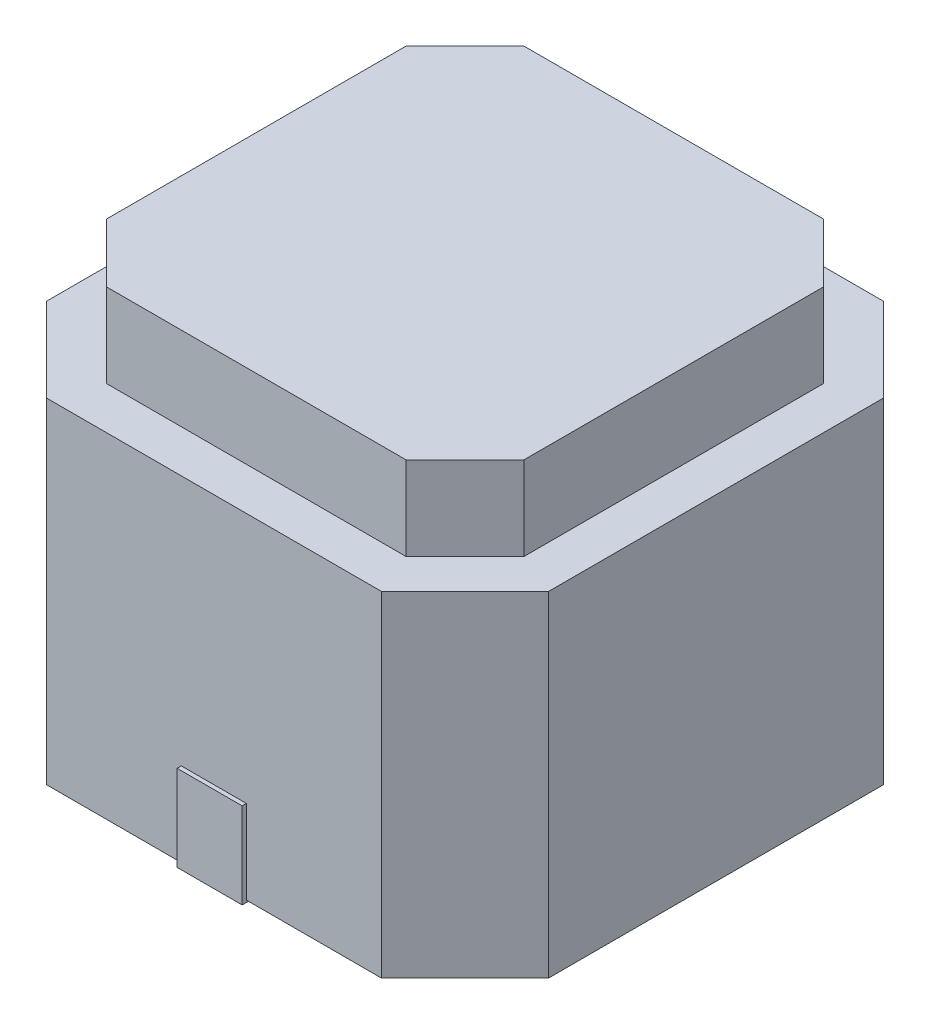
ISO-10303-21;
HEADER;
FILE_DESCRIPTION(('STEP AP214'),'2;1');
FILE_NAME('part.step','',(''),(''),'','','');
FILE_SCHEMA(('AUTOMOTIVE_DESIGN { 1 0 10303 214 1 1 1 1 }'));
ENDSEC;
DATA;
#1=APPLICATION_CONTEXT('core data for automotive mechanical design processes');
#2=APPLICATION_PROTOCOL_DEFINITION('international standard','automotive_design',2000,#1);
#3=PRODUCT_CONTEXT('',#1,'mechanical');
#4=PRODUCT('Part','Part','',(#3));
#5=PRODUCT_RELATED_PRODUCT_CATEGORY('part','',(#4));
#6=PRODUCT_DEFINITION_FORMATION('','',#4);
#7=PRODUCT_DEFINITION_CONTEXT('part definition',#1,'design');
#8=PRODUCT_DEFINITION('design','',#6,#7);
#9=PRODUCT_DEFINITION_SHAPE('','',#8);
#10=(LENGTH_UNIT() NAMED_UNIT(*) SI_UNIT(.MILLI.,.METRE.));
#11=(NAMED_UNIT(*) PLANE_ANGLE_UNIT() SI_UNIT($,.RADIAN.));
#12=(NAMED_UNIT(*) SI_UNIT($,.STERADIAN.) SOLID_ANGLE_UNIT());
#13=UNCERTAINTY_MEASURE_WITH_UNIT(LENGTH_MEASURE(1.E-05),#10,'distance_accuracy_value','');
#14=(GEOMETRIC_REPRESENTATION_CONTEXT(3) GLOBAL_UNCERTAINTY_ASSIGNED_CONTEXT((#13)) GLOBAL_UNIT_ASSIGNED_CONTEXT((#10,
#11,#12)) REPRESENTATION_CONTEXT('',''));
#15=CARTESIAN_POINT('',(0.,0.,0.));
#16=DIRECTION('',(0.,0.,1.));
#17=DIRECTION('',(1.,0.,0.));
#18=AXIS2_PLACEMENT_3D('',#15,#16,#17);
#19=CARTESIAN_POINT('',(2.,5.,-3.));
#20=DIRECTION('',(-0.707106781186548,0.,0.707106781186547));
#21=DIRECTION('',(0.707106781186547,0.,0.707106781186548));
#22=AXIS2_PLACEMENT_3D('',#19,#20,#21);
#23=PLANE('',#22);
#24=DIRECTION('',(-0.707106781186547,0.,-0.707106781186548));
#25=VECTOR('',#24,1.);
#26=CARTESIAN_POINT('',(2.5,4.,-2.5));
#27=LINE('',#26,#25);
#28=CARTESIAN_POINT('',(3.,4.,-2.));
#29=VERTEX_POINT('',#28);
#30=CARTESIAN_POINT('',(2.,4.,-3.));
#31=VERTEX_POINT('',#30);
#32=EDGE_CURVE('E408',#29,#31,#27,.T.);
#33=ORIENTED_EDGE('',*,*,#32,.F.);
#34=DIRECTION('',(0.,-1.,0.));
#35=VECTOR('',#34,1.);
#36=CARTESIAN_POINT('',(3.,5.,-2.));
#37=LINE('',#36,#35);
#38=CARTESIAN_POINT('',(3.,0.,-2.));
#39=VERTEX_POINT('',#38);
#40=EDGE_CURVE('E487',#29,#39,#37,.T.);
#41=ORIENTED_EDGE('',*,*,#40,.T.);
#42=DIRECTION('',(-0.707106781186547,0.,-0.707106781186548));
#43=VECTOR('',#42,1.);
#44=CARTESIAN_POINT('',(2.,0.,-3.));
#45=LINE('',#44,#43);
#46=CARTESIAN_POINT('',(2.,0.,-3.));
#47=VERTEX_POINT('',#46);
#48=EDGE_CURVE('E448',#39,#47,#45,.T.);
#49=ORIENTED_EDGE('',*,*,#48,.T.);
#50=DIRECTION('',(0.,-1.,0.));
#51=VECTOR('',#50,1.);
#52=CARTESIAN_POINT('',(2.,5.,-3.));
#53=LINE('',#52,#51);
#54=EDGE_CURVE('E503',#31,#47,#53,.T.);
#55=ORIENTED_EDGE('',*,*,#54,.F.);
#56=EDGE_LOOP('',(#33,#41,#49,#55));
#57=FACE_BOUND('',#56,.T.);
#58=ADVANCED_FACE('F128',(#57),#23,.F.);
#59=CARTESIAN_POINT('',(-2.,5.,-3.));
#60=DIRECTION('',(0.,0.,1.));
#61=DIRECTION('',(1.,0.,0.));
#62=AXIS2_PLACEMENT_3D('',#59,#60,#61);
#63=PLANE('',#62);
#64=DIRECTION('',(-1.,0.,0.));
#65=VECTOR('',#64,1.);
#66=CARTESIAN_POINT('',(-2.,0.,-3.));
#67=LINE('',#66,#65);
#68=CARTESIAN_POINT('',(0.388576459248803,0.,-3.));
#69=VERTEX_POINT('',#68);
#70=EDGE_CURVE('E466',#47,#69,#67,.T.);
#71=ORIENTED_EDGE('',*,*,#70,.T.);
#72=DIRECTION('',(0.,1.,0.));
#73=VECTOR('',#72,1.);
#74=CARTESIAN_POINT('',(0.388576459248805,5.,-3.));
#75=LINE('',#74,#73);
#76=CARTESIAN_POINT('',(0.388576459248805,1.,-3.));
#77=VERTEX_POINT('',#76);
#78=EDGE_CURVE('E385',#69,#77,#75,.T.);
#79=ORIENTED_EDGE('',*,*,#78,.T.);
#80=DIRECTION('',(1.,0.,0.));
#81=VECTOR('',#80,1.);
#82=CARTESIAN_POINT('',(-2.,1.,-3.));
#83=LINE('',#82,#81);
#84=CARTESIAN_POINT('',(-0.388576459248804,1.,-3.));
#85=VERTEX_POINT('',#84);
#86=EDGE_CURVE('E512',#85,#77,#83,.T.);
#87=ORIENTED_EDGE('',*,*,#86,.F.);
#88=DIRECTION('',(0.,1.,0.));
#89=VECTOR('',#88,1.);
#90=CARTESIAN_POINT('',(-0.388576459248804,5.,-3.));
#91=LINE('',#90,#89);
#92=CARTESIAN_POINT('',(-0.388576459248804,0.,-3.));
#93=VERTEX_POINT('',#92);
#94=EDGE_CURVE('E382',#93,#85,#91,.T.);
#95=ORIENTED_EDGE('',*,*,#94,.F.);
#96=CARTESIAN_POINT('',(-2.,0.,-3.));
#97=VERTEX_POINT('',#96);
#98=EDGE_CURVE('E465',#93,#97,#67,.T.);
#99=ORIENTED_EDGE('',*,*,#98,.T.);
#100=DIRECTION('',(0.,-1.,0.));
#101=VECTOR('',#100,1.);
#102=CARTESIAN_POINT('',(-2.,5.,-3.));
#103=LINE('',#102,#101);
#104=CARTESIAN_POINT('',(-2.,4.,-3.));
#105=VERTEX_POINT('',#104);
#106=EDGE_CURVE('E500',#105,#97,#103,.T.);
#107=ORIENTED_EDGE('',*,*,#106,.F.);
#108=DIRECTION('',(-1.,0.,0.));
#109=VECTOR('',#108,1.);
#110=CARTESIAN_POINT('',(0.,4.,-3.));
#111=LINE('',#110,#109);
#112=EDGE_CURVE('E410',#31,#105,#111,.T.);
#113=ORIENTED_EDGE('',*,*,#112,.F.);
#114=ORIENTED_EDGE('',*,*,#54,.T.);
#115=EDGE_LOOP('',(#71,#79,#87,#95,#99,#107,#113,#114));
#116=FACE_BOUND('',#115,.T.);
#117=ADVANCED_FACE('F546',(#116),#63,.F.);
#118=CARTESIAN_POINT('',(-3.,5.,-2.));
#119=DIRECTION('',(0.707106781186548,0.,0.707106781186548));
#120=DIRECTION('',(0.707106781186548,0.,-0.707106781186548));
#121=AXIS2_PLACEMENT_3D('',#118,#119,#120);
#122=PLANE('',#121);
#123=DIRECTION('',(-0.707106781186548,0.,0.707106781186548));
#124=VECTOR('',#123,1.);
#125=CARTESIAN_POINT('',(-2.5,4.,-2.5));
#126=LINE('',#125,#124);
#127=CARTESIAN_POINT('',(-3.,4.,-2.));
#128=VERTEX_POINT('',#127);
#129=EDGE_CURVE('E412',#105,#128,#126,.T.);
#130=ORIENTED_EDGE('',*,*,#129,.F.);
#131=ORIENTED_EDGE('',*,*,#106,.T.);
#132=DIRECTION('',(-0.707106781186548,0.,0.707106781186548));
#133=VECTOR('',#132,1.);
#134=CARTESIAN_POINT('',(-3.,0.,-2.));
#135=LINE('',#134,#133);
#136=CARTESIAN_POINT('',(-3.,0.,-2.));
#137=VERTEX_POINT('',#136);
#138=EDGE_CURVE('E469',#97,#137,#135,.T.);
#139=ORIENTED_EDGE('',*,*,#138,.T.);
#140=DIRECTION('',(0.,-1.,0.));
#141=VECTOR('',#140,1.);
#142=CARTESIAN_POINT('',(-3.,5.,-2.));
#143=LINE('',#142,#141);
#144=EDGE_CURVE('E498',#128,#137,#143,.T.);
#145=ORIENTED_EDGE('',*,*,#144,.F.);
#146=EDGE_LOOP('',(#130,#131,#139,#145));
#147=FACE_BOUND('',#146,.T.);
#148=ADVANCED_FACE('F551',(#147),#122,.F.);
#149=CARTESIAN_POINT('',(-3.,5.,-2.));
#150=DIRECTION('',(1.,0.,0.));
#151=DIRECTION('',(0.,0.,-1.));
#152=AXIS2_PLACEMENT_3D('',#149,#150,#151);
#153=PLANE('',#152);
#154=DIRECTION('',(0.,0.,1.));
#155=VECTOR('',#154,1.);
#156=CARTESIAN_POINT('',(-3.,4.,0.));
#157=LINE('',#156,#155);
#158=CARTESIAN_POINT('',(-3.,4.,2.));
#159=VERTEX_POINT('',#158);
#160=EDGE_CURVE('E414',#128,#159,#157,.T.);
#161=ORIENTED_EDGE('',*,*,#160,.F.);
#162=ORIENTED_EDGE('',*,*,#144,.T.);
#163=DIRECTION('',(0.,0.,1.));
#164=VECTOR('',#163,1.);
#165=CARTESIAN_POINT('',(-3.,0.,-2.));
#166=LINE('',#165,#164);
#167=CARTESIAN_POINT('',(-3.,0.,2.));
#168=VERTEX_POINT('',#167);
#169=EDGE_CURVE('E472',#137,#168,#166,.T.);
#170=ORIENTED_EDGE('',*,*,#169,.T.);
#171=DIRECTION('',(0.,-1.,0.));
#172=VECTOR('',#171,1.);
#173=CARTESIAN_POINT('',(-3.,5.,2.));
#174=LINE('',#173,#172);
#175=EDGE_CURVE('E496',#159,#168,#174,.T.);
#176=ORIENTED_EDGE('',*,*,#175,.F.);
#177=EDGE_LOOP('',(#161,#162,#170,#176));
#178=FACE_BOUND('',#177,.T.);
#179=ADVANCED_FACE('F659',(#178),#153,.F.);
#180=CARTESIAN_POINT('',(-3.,5.,2.));
#181=DIRECTION('',(0.707106781186548,0.,-0.707106781186548));
#182=DIRECTION('',(-0.707106781186548,0.,-0.707106781186548));
#183=AXIS2_PLACEMENT_3D('',#180,#181,#182);
#184=PLANE('',#183);
#185=DIRECTION('',(0.707106781186548,0.,0.707106781186548));
#186=VECTOR('',#185,1.);
#187=CARTESIAN_POINT('',(-2.5,4.,2.5));
#188=LINE('',#187,#186);
#189=CARTESIAN_POINT('',(-2.,4.,3.));
#190=VERTEX_POINT('',#189);
#191=EDGE_CURVE('E416',#159,#190,#188,.T.);
#192=ORIENTED_EDGE('',*,*,#191,.F.);
#193=ORIENTED_EDGE('',*,*,#175,.T.);
#194=DIRECTION('',(0.707106781186548,0.,0.707106781186548));
#195=VECTOR('',#194,1.);
#196=CARTESIAN_POINT('',(-3.,0.,2.));
#197=LINE('',#196,#195);
#198=CARTESIAN_POINT('',(-2.,0.,3.));
#199=VERTEX_POINT('',#198);
#200=EDGE_CURVE('E475',#168,#199,#197,.T.);
#201=ORIENTED_EDGE('',*,*,#200,.T.);
#202=DIRECTION('',(0.,-1.,0.));
#203=VECTOR('',#202,1.);
#204=CARTESIAN_POINT('',(-2.,5.,3.));
#205=LINE('',#204,#203);
#206=EDGE_CURVE('E494',#190,#199,#205,.T.);
#207=ORIENTED_EDGE('',*,*,#206,.F.);
#208=EDGE_LOOP('',(#192,#193,#201,#207));
#209=FACE_BOUND('',#208,.T.);
#210=ADVANCED_FACE('F656',(#209),#184,.F.);
#211=CARTESIAN_POINT('',(-2.,5.,3.));
#212=DIRECTION('',(0.,0.,-1.));
#213=DIRECTION('',(-1.,0.,0.));
#214=AXIS2_PLACEMENT_3D('',#211,#212,#213);
#215=PLANE('',#214);
#216=DIRECTION('',(1.,0.,0.));
#217=VECTOR('',#216,1.);
#218=CARTESIAN_POINT('',(-2.,0.,3.));
#219=LINE('',#218,#217);
#220=CARTESIAN_POINT('',(-0.388576459248804,0.,3.));
#221=VERTEX_POINT('',#220);
#222=EDGE_CURVE('E479',#199,#221,#219,.T.);
#223=ORIENTED_EDGE('',*,*,#222,.T.);
#224=DIRECTION('',(0.,1.,0.));
#225=VECTOR('',#224,1.);
#226=CARTESIAN_POINT('',(-0.388576459248804,5.,3.));
#227=LINE('',#226,#225);
#228=CARTESIAN_POINT('',(-0.388576459248805,1.,3.));
#229=VERTEX_POINT('',#228);
#230=EDGE_CURVE('E142',#221,#229,#227,.T.);
#231=ORIENTED_EDGE('',*,*,#230,.T.);
#232=DIRECTION('',(-1.,0.,0.));
#233=VECTOR('',#232,1.);
#234=CARTESIAN_POINT('',(-2.,1.,3.));
#235=LINE('',#234,#233);
#236=CARTESIAN_POINT('',(0.388576459248804,1.,3.));
#237=VERTEX_POINT('',#236);
#238=EDGE_CURVE('E12',#237,#229,#235,.T.);
#239=ORIENTED_EDGE('',*,*,#238,.F.);
#240=DIRECTION('',(0.,1.,0.));
#241=VECTOR('',#240,1.);
#242=CARTESIAN_POINT('',(0.388576459248804,5.,3.));
#243=LINE('',#242,#241);
#244=CARTESIAN_POINT('',(0.388576459248804,0.,3.));
#245=VERTEX_POINT('',#244);
#246=EDGE_CURVE('E350',#245,#237,#243,.T.);
#247=ORIENTED_EDGE('',*,*,#246,.F.);
#248=CARTESIAN_POINT('',(2.,0.,3.));
#249=VERTEX_POINT('',#248);
#250=EDGE_CURVE('E478',#245,#249,#219,.T.);
#251=ORIENTED_EDGE('',*,*,#250,.T.);
#252=DIRECTION('',(0.,-1.,0.));
#253=VECTOR('',#252,1.);
#254=CARTESIAN_POINT('',(2.,5.,3.));
#255=LINE('',#254,#253);
#256=CARTESIAN_POINT('',(2.,4.,3.));
#257=VERTEX_POINT('',#256);
#258=EDGE_CURVE('E491',#257,#249,#255,.T.);
#259=ORIENTED_EDGE('',*,*,#258,.F.);
#260=DIRECTION('',(1.,0.,0.));
#261=VECTOR('',#260,1.);
#262=CARTESIAN_POINT('',(0.,4.,3.));
#263=LINE('',#262,#261);
#264=EDGE_CURVE('E418',#190,#257,#263,.T.);
#265=ORIENTED_EDGE('',*,*,#264,.F.);
#266=ORIENTED_EDGE('',*,*,#206,.T.);
#267=EDGE_LOOP('',(#223,#231,#239,#247,#251,#259,#265,#266));
#268=FACE_BOUND('',#267,.T.);
#269=ADVANCED_FACE('F523',(#268),#215,.F.);
#270=CARTESIAN_POINT('',(2.,5.,3.));
#271=DIRECTION('',(-0.707106781186548,0.,-0.707106781186548));
#272=DIRECTION('',(-0.707106781186548,0.,0.707106781186548));
#273=AXIS2_PLACEMENT_3D('',#270,#271,#272);
#274=PLANE('',#273);
#275=DIRECTION('',(0.707106781186548,0.,-0.707106781186548));
#276=VECTOR('',#275,1.);
#277=CARTESIAN_POINT('',(2.5,4.,2.5));
#278=LINE('',#277,#276);
#279=CARTESIAN_POINT('',(3.,4.,2.));
#280=VERTEX_POINT('',#279);
#281=EDGE_CURVE('E420',#257,#280,#278,.T.);
#282=ORIENTED_EDGE('',*,*,#281,.F.);
#283=ORIENTED_EDGE('',*,*,#258,.T.);
#284=DIRECTION('',(0.707106781186548,0.,-0.707106781186548));
#285=VECTOR('',#284,1.);
#286=CARTESIAN_POINT('',(2.,0.,3.));
#287=LINE('',#286,#285);
#288=CARTESIAN_POINT('',(3.,0.,2.));
#289=VERTEX_POINT('',#288);
#290=EDGE_CURVE('E481',#249,#289,#287,.T.);
#291=ORIENTED_EDGE('',*,*,#290,.T.);
#292=DIRECTION('',(0.,-1.,0.));
#293=VECTOR('',#292,1.);
#294=CARTESIAN_POINT('',(3.,5.,2.));
#295=LINE('',#294,#293);
#296=EDGE_CURVE('E489',#280,#289,#295,.T.);
#297=ORIENTED_EDGE('',*,*,#296,.F.);
#298=EDGE_LOOP('',(#282,#283,#291,#297));
#299=FACE_BOUND('',#298,.T.);
#300=ADVANCED_FACE('F650',(#299),#274,.F.);
#301=CARTESIAN_POINT('',(3.,5.,-2.));
#302=DIRECTION('',(-1.,0.,0.));
#303=DIRECTION('',(0.,0.,1.));
#304=AXIS2_PLACEMENT_3D('',#301,#302,#303);
#305=PLANE('',#304);
#306=DIRECTION('',(0.,0.,-1.));
#307=VECTOR('',#306,1.);
#308=CARTESIAN_POINT('',(3.,4.,0.));
#309=LINE('',#308,#307);
#310=EDGE_CURVE('E406',#280,#29,#309,.T.);
#311=ORIENTED_EDGE('',*,*,#310,.F.);
#312=ORIENTED_EDGE('',*,*,#296,.T.);
#313=DIRECTION('',(0.,0.,-1.));
#314=VECTOR('',#313,1.);
#315=CARTESIAN_POINT('',(3.,0.,-2.));
#316=LINE('',#315,#314);
#317=EDGE_CURVE('E484',#289,#39,#316,.T.);
#318=ORIENTED_EDGE('',*,*,#317,.T.);
#319=ORIENTED_EDGE('',*,*,#40,.F.);
#320=EDGE_LOOP('',(#311,#312,#318,#319));
#321=FACE_BOUND('',#320,.T.);
#322=ADVANCED_FACE('F560',(#321),#305,.F.);
#323=CARTESIAN_POINT('',(0.,0.,0.));
#324=DIRECTION('',(0.,1.,0.));
#325=DIRECTION('',(0.,0.,1.));
#326=AXIS2_PLACEMENT_3D('',#323,#324,#325);
#327=PLANE('',#326);
#328=DIRECTION('',(-1.,0.,0.));
#329=VECTOR('',#328,1.);
#330=CARTESIAN_POINT('',(0.,0.,1.37079458681767));
#331=LINE('',#330,#329);
#332=CARTESIAN_POINT('',(0.388576459248803,0.,1.37079458681767));
#333=VERTEX_POINT('',#332);
#334=CARTESIAN_POINT('',(-0.388576459248804,0.,1.37079458681767));
#335=VERTEX_POINT('',#334);
#336=EDGE_CURVE('E317',#333,#335,#331,.T.);
#337=ORIENTED_EDGE('',*,*,#336,.T.);
#338=DIRECTION('',(0.,0.,1.));
#339=VECTOR('',#338,1.);
#340=CARTESIAN_POINT('',(-0.388576459248804,0.,0.));
#341=LINE('',#340,#339);
#342=EDGE_CURVE('E135',#335,#221,#341,.T.);
#343=ORIENTED_EDGE('',*,*,#342,.T.);
#344=ORIENTED_EDGE('',*,*,#222,.F.);
#345=ORIENTED_EDGE('',*,*,#200,.F.);
#346=ORIENTED_EDGE('',*,*,#169,.F.);
#347=ORIENTED_EDGE('',*,*,#138,.F.);
#348=ORIENTED_EDGE('',*,*,#98,.F.);
#349=DIRECTION('',(0.,0.,-1.));
#350=VECTOR('',#349,1.);
#351=CARTESIAN_POINT('',(-0.388576459248805,0.,0.));
#352=LINE('',#351,#350);
#353=CARTESIAN_POINT('',(-0.388576459248804,0.,-1.37079458681767));
#354=VERTEX_POINT('',#353);
#355=EDGE_CURVE('E505',#354,#93,#352,.T.);
#356=ORIENTED_EDGE('',*,*,#355,.F.);
#357=DIRECTION('',(1.,0.,0.));
#358=VECTOR('',#357,1.);
#359=CARTESIAN_POINT('',(0.,0.,-1.37079458681767));
#360=LINE('',#359,#358);
#361=CARTESIAN_POINT('',(0.388576459248801,0.,-1.37079458681767));
#362=VERTEX_POINT('',#361);
#363=EDGE_CURVE('E508',#354,#362,#360,.T.);
#364=ORIENTED_EDGE('',*,*,#363,.T.);
#365=DIRECTION('',(0.,0.,-1.));
#366=VECTOR('',#365,1.);
#367=CARTESIAN_POINT('',(0.388576459248798,0.,0.));
#368=LINE('',#367,#366);
#369=EDGE_CURVE('E510',#362,#69,#368,.T.);
#370=ORIENTED_EDGE('',*,*,#369,.T.);
#371=ORIENTED_EDGE('',*,*,#70,.F.);
#372=ORIENTED_EDGE('',*,*,#48,.F.);
#373=ORIENTED_EDGE('',*,*,#317,.F.);
#374=ORIENTED_EDGE('',*,*,#290,.F.);
#375=ORIENTED_EDGE('',*,*,#250,.F.);
#376=DIRECTION('',(0.,0.,1.));
#377=VECTOR('',#376,1.);
#378=CARTESIAN_POINT('',(0.388576459248802,0.,0.));
#379=LINE('',#378,#377);
#380=EDGE_CURVE('E515',#333,#245,#379,.T.);
#381=ORIENTED_EDGE('',*,*,#380,.F.);
#382=EDGE_LOOP('',(#337,#343,#344,#345,#346,#347,#348,#356,#364,#370,#371,#372,#373,#374,#375,#381));
#383=FACE_BOUND('',#382,.T.);
#384=ADVANCED_FACE('F520',(#383),#327,.F.);
#385=CARTESIAN_POINT('',(2.492,4.,0.));
#386=DIRECTION('',(1.,0.,0.));
#387=DIRECTION('',(0.,0.,-1.));
#388=AXIS2_PLACEMENT_3D('',#385,#386,#387);
#389=PLANE('',#388);
#390=DIRECTION('',(0.,0.,-1.));
#391=VECTOR('',#390,1.);
#392=CARTESIAN_POINT('',(2.492,5.,0.));
#393=LINE('',#392,#391);
#394=CARTESIAN_POINT('',(2.492,5.,1.78957951031447));
#395=VERTEX_POINT('',#394);
#396=CARTESIAN_POINT('',(2.492,5.,-1.78957951031447));
#397=VERTEX_POINT('',#396);
#398=EDGE_CURVE('E387',#395,#397,#393,.T.);
#399=ORIENTED_EDGE('',*,*,#398,.F.);
#400=DIRECTION('',(0.,1.,0.));
#401=VECTOR('',#400,1.);
#402=CARTESIAN_POINT('',(2.492,4.,1.78957951031447));
#403=LINE('',#402,#401);
#404=CARTESIAN_POINT('',(2.492,4.,1.78957951031447));
#405=VERTEX_POINT('',#404);
#406=EDGE_CURVE('E422',#405,#395,#403,.T.);
#407=ORIENTED_EDGE('',*,*,#406,.F.);
#408=DIRECTION('',(0.,0.,-1.));
#409=VECTOR('',#408,1.);
#410=CARTESIAN_POINT('',(2.492,4.,0.));
#411=LINE('',#410,#409);
#412=CARTESIAN_POINT('',(2.492,4.,-1.78957951031447));
#413=VERTEX_POINT('',#412);
#414=EDGE_CURVE('E388',#405,#413,#411,.T.);
#415=ORIENTED_EDGE('',*,*,#414,.T.);
#416=DIRECTION('',(0.,1.,0.));
#417=VECTOR('',#416,1.);
#418=CARTESIAN_POINT('',(2.492,4.,-1.78957951031447));
#419=LINE('',#418,#417);
#420=EDGE_CURVE('E445',#413,#397,#419,.T.);
#421=ORIENTED_EDGE('',*,*,#420,.T.);
#422=EDGE_LOOP('',(#399,#407,#415,#421));
#423=FACE_BOUND('',#422,.T.);
#424=ADVANCED_FACE('F616',(#423),#389,.T.);
#425=CARTESIAN_POINT('',(2.14078975515723,4.,-2.14078975515723));
#426=DIRECTION('',(0.707106781186548,0.,-0.707106781186547));
#427=DIRECTION('',(-0.707106781186547,0.,-0.707106781186548));
#428=AXIS2_PLACEMENT_3D('',#425,#426,#427);
#429=PLANE('',#428);
#430=DIRECTION('',(-0.707106781186547,0.,-0.707106781186548));
#431=VECTOR('',#430,1.);
#432=CARTESIAN_POINT('',(2.14078975515723,5.,-2.14078975515723));
#433=LINE('',#432,#431);
#434=CARTESIAN_POINT('',(1.78957951031447,5.,-2.492));
#435=VERTEX_POINT('',#434);
#436=EDGE_CURVE('E392',#397,#435,#433,.T.);
#437=ORIENTED_EDGE('',*,*,#436,.F.);
#438=ORIENTED_EDGE('',*,*,#420,.F.);
#439=DIRECTION('',(-0.707106781186547,0.,-0.707106781186548));
#440=VECTOR('',#439,1.);
#441=CARTESIAN_POINT('',(2.14078975515723,4.,-2.14078975515723));
#442=LINE('',#441,#440);
#443=CARTESIAN_POINT('',(1.78957951031447,4.,-2.492));
#444=VERTEX_POINT('',#443);
#445=EDGE_CURVE('E404',#413,#444,#442,.T.);
#446=ORIENTED_EDGE('',*,*,#445,.T.);
#447=DIRECTION('',(0.,1.,0.));
#448=VECTOR('',#447,1.);
#449=CARTESIAN_POINT('',(1.78957951031447,4.,-2.492));
#450=LINE('',#449,#448);
#451=EDGE_CURVE('E449',#444,#435,#450,.T.);
#452=ORIENTED_EDGE('',*,*,#451,.T.);
#453=EDGE_LOOP('',(#437,#438,#446,#452));
#454=FACE_BOUND('',#453,.T.);
#455=ADVANCED_FACE('F612',(#454),#429,.T.);
#456=CARTESIAN_POINT('',(0.,4.,-2.492));
#457=DIRECTION('',(0.,0.,-1.));
#458=DIRECTION('',(-1.,0.,0.));
#459=AXIS2_PLACEMENT_3D('',#456,#457,#458);
#460=PLANE('',#459);
#461=DIRECTION('',(-1.,0.,0.));
#462=VECTOR('',#461,1.);
#463=CARTESIAN_POINT('',(0.,5.,-2.492));
#464=LINE('',#463,#462);
#465=CARTESIAN_POINT('',(-1.78957951031447,5.,-2.492));
#466=VERTEX_POINT('',#465);
#467=EDGE_CURVE('E440',#435,#466,#464,.T.);
#468=ORIENTED_EDGE('',*,*,#467,.F.);
#469=ORIENTED_EDGE('',*,*,#451,.F.);
#470=DIRECTION('',(-1.,0.,0.));
#471=VECTOR('',#470,1.);
#472=CARTESIAN_POINT('',(0.,4.,-2.492));
#473=LINE('',#472,#471);
#474=CARTESIAN_POINT('',(-1.78957951031447,4.,-2.492));
#475=VERTEX_POINT('',#474);
#476=EDGE_CURVE('E402',#444,#475,#473,.T.);
#477=ORIENTED_EDGE('',*,*,#476,.T.);
#478=DIRECTION('',(0.,1.,0.));
#479=VECTOR('',#478,1.);
#480=CARTESIAN_POINT('',(-1.78957951031447,4.,-2.492));
#481=LINE('',#480,#479);
#482=EDGE_CURVE('E451',#475,#466,#481,.T.);
#483=ORIENTED_EDGE('',*,*,#482,.T.);
#484=EDGE_LOOP('',(#468,#469,#477,#483));
#485=FACE_BOUND('',#484,.T.);
#486=ADVANCED_FACE('F615',(#485),#460,.T.);
#487=CARTESIAN_POINT('',(-2.14078975515723,4.,-2.14078975515723));
#488=DIRECTION('',(-0.707106781186547,0.,-0.707106781186547));
#489=DIRECTION('',(-0.707106781186548,0.,0.707106781186548));
#490=AXIS2_PLACEMENT_3D('',#487,#488,#489);
#491=PLANE('',#490);
#492=DIRECTION('',(-0.707106781186548,0.,0.707106781186548));
#493=VECTOR('',#492,1.);
#494=CARTESIAN_POINT('',(-2.14078975515723,5.,-2.14078975515723));
#495=LINE('',#494,#493);
#496=CARTESIAN_POINT('',(-2.492,5.,-1.78957951031447));
#497=VERTEX_POINT('',#496);
#498=EDGE_CURVE('E437',#466,#497,#495,.T.);
#499=ORIENTED_EDGE('',*,*,#498,.F.);
#500=ORIENTED_EDGE('',*,*,#482,.F.);
#501=DIRECTION('',(-0.707106781186548,0.,0.707106781186548));
#502=VECTOR('',#501,1.);
#503=CARTESIAN_POINT('',(-2.14078975515723,4.,-2.14078975515723));
#504=LINE('',#503,#502);
#505=CARTESIAN_POINT('',(-2.492,4.,-1.78957951031447));
#506=VERTEX_POINT('',#505);
#507=EDGE_CURVE('E400',#475,#506,#504,.T.);
#508=ORIENTED_EDGE('',*,*,#507,.T.);
#509=DIRECTION('',(0.,1.,0.));
#510=VECTOR('',#509,1.);
#511=CARTESIAN_POINT('',(-2.492,4.,-1.78957951031447));
#512=LINE('',#511,#510);
#513=EDGE_CURVE('E453',#506,#497,#512,.T.);
#514=ORIENTED_EDGE('',*,*,#513,.T.);
#515=EDGE_LOOP('',(#499,#500,#508,#514));
#516=FACE_BOUND('',#515,.T.);
#517=ADVANCED_FACE('F620',(#516),#491,.T.);
#518=CARTESIAN_POINT('',(-2.492,4.,0.));
#519=DIRECTION('',(-1.,0.,0.));
#520=DIRECTION('',(0.,0.,1.));
#521=AXIS2_PLACEMENT_3D('',#518,#519,#520);
#522=PLANE('',#521);
#523=DIRECTION('',(0.,0.,1.));
#524=VECTOR('',#523,1.);
#525=CARTESIAN_POINT('',(-2.492,5.,0.));
#526=LINE('',#525,#524);
#527=CARTESIAN_POINT('',(-2.492,5.,1.78957951031447));
#528=VERTEX_POINT('',#527);
#529=EDGE_CURVE('E434',#497,#528,#526,.T.);
#530=ORIENTED_EDGE('',*,*,#529,.F.);
#531=ORIENTED_EDGE('',*,*,#513,.F.);
#532=DIRECTION('',(0.,0.,1.));
#533=VECTOR('',#532,1.);
#534=CARTESIAN_POINT('',(-2.492,4.,0.));
#535=LINE('',#534,#533);
#536=CARTESIAN_POINT('',(-2.492,4.,1.78957951031447));
#537=VERTEX_POINT('',#536);
#538=EDGE_CURVE('E398',#506,#537,#535,.T.);
#539=ORIENTED_EDGE('',*,*,#538,.T.);
#540=DIRECTION('',(0.,1.,0.));
#541=VECTOR('',#540,1.);
#542=CARTESIAN_POINT('',(-2.492,4.,1.78957951031447));
#543=LINE('',#542,#541);
#544=EDGE_CURVE('E455',#537,#528,#543,.T.);
#545=ORIENTED_EDGE('',*,*,#544,.T.);
#546=EDGE_LOOP('',(#530,#531,#539,#545));
#547=FACE_BOUND('',#546,.T.);
#548=ADVANCED_FACE('F624',(#547),#522,.T.);
#549=CARTESIAN_POINT('',(-2.14078975515723,4.,2.14078975515723));
#550=DIRECTION('',(-0.707106781186547,0.,0.707106781186547));
#551=DIRECTION('',(0.707106781186548,0.,0.707106781186548));
#552=AXIS2_PLACEMENT_3D('',#549,#550,#551);
#553=PLANE('',#552);
#554=DIRECTION('',(0.707106781186548,0.,0.707106781186548));
#555=VECTOR('',#554,1.);
#556=CARTESIAN_POINT('',(-2.14078975515723,5.,2.14078975515723));
#557=LINE('',#556,#555);
#558=CARTESIAN_POINT('',(-1.78957951031447,5.,2.492));
#559=VERTEX_POINT('',#558);
#560=EDGE_CURVE('E431',#528,#559,#557,.T.);
#561=ORIENTED_EDGE('',*,*,#560,.F.);
#562=ORIENTED_EDGE('',*,*,#544,.F.);
#563=DIRECTION('',(0.707106781186548,0.,0.707106781186548));
#564=VECTOR('',#563,1.);
#565=CARTESIAN_POINT('',(-2.14078975515723,4.,2.14078975515723));
#566=LINE('',#565,#564);
#567=CARTESIAN_POINT('',(-1.78957951031447,4.,2.492));
#568=VERTEX_POINT('',#567);
#569=EDGE_CURVE('E396',#537,#568,#566,.T.);
#570=ORIENTED_EDGE('',*,*,#569,.T.);
#571=DIRECTION('',(0.,1.,0.));
#572=VECTOR('',#571,1.);
#573=CARTESIAN_POINT('',(-1.78957951031447,4.,2.492));
#574=LINE('',#573,#572);
#575=EDGE_CURVE('E457',#568,#559,#574,.T.);
#576=ORIENTED_EDGE('',*,*,#575,.T.);
#577=EDGE_LOOP('',(#561,#562,#570,#576));
#578=FACE_BOUND('',#577,.T.);
#579=ADVANCED_FACE('F628',(#578),#553,.T.);
#580=CARTESIAN_POINT('',(0.,4.,2.492));
#581=DIRECTION('',(0.,0.,1.));
#582=DIRECTION('',(1.,0.,0.));
#583=AXIS2_PLACEMENT_3D('',#580,#581,#582);
#584=PLANE('',#583);
#585=DIRECTION('',(1.,0.,0.));
#586=VECTOR('',#585,1.);
#587=CARTESIAN_POINT('',(0.,5.,2.492));
#588=LINE('',#587,#586);
#589=CARTESIAN_POINT('',(1.78957951031447,5.,2.492));
#590=VERTEX_POINT('',#589);
#591=EDGE_CURVE('E428',#559,#590,#588,.T.);
#592=ORIENTED_EDGE('',*,*,#591,.F.);
#593=ORIENTED_EDGE('',*,*,#575,.F.);
#594=DIRECTION('',(1.,0.,0.));
#595=VECTOR('',#594,1.);
#596=CARTESIAN_POINT('',(0.,4.,2.492));
#597=LINE('',#596,#595);
#598=CARTESIAN_POINT('',(1.78957951031447,4.,2.492));
#599=VERTEX_POINT('',#598);
#600=EDGE_CURVE('E394',#568,#599,#597,.T.);
#601=ORIENTED_EDGE('',*,*,#600,.T.);
#602=DIRECTION('',(0.,1.,0.));
#603=VECTOR('',#602,1.);
#604=CARTESIAN_POINT('',(1.78957951031447,4.,2.492));
#605=LINE('',#604,#603);
#606=EDGE_CURVE('E459',#599,#590,#605,.T.);
#607=ORIENTED_EDGE('',*,*,#606,.T.);
#608=EDGE_LOOP('',(#592,#593,#601,#607));
#609=FACE_BOUND('',#608,.T.);
#610=ADVANCED_FACE('F632',(#609),#584,.T.);
#611=CARTESIAN_POINT('',(2.14078975515723,4.,2.14078975515723));
#612=DIRECTION('',(0.707106781186547,0.,0.707106781186547));
#613=DIRECTION('',(0.707106781186548,0.,-0.707106781186548));
#614=AXIS2_PLACEMENT_3D('',#611,#612,#613);
#615=PLANE('',#614);
#616=DIRECTION('',(0.707106781186548,0.,-0.707106781186548));
#617=VECTOR('',#616,1.);
#618=CARTESIAN_POINT('',(2.14078975515723,5.,2.14078975515723));
#619=LINE('',#618,#617);
#620=EDGE_CURVE('E425',#590,#395,#619,.T.);
#621=ORIENTED_EDGE('',*,*,#620,.F.);
#622=ORIENTED_EDGE('',*,*,#606,.F.);
#623=DIRECTION('',(0.707106781186548,0.,-0.707106781186548));
#624=VECTOR('',#623,1.);
#625=CARTESIAN_POINT('',(2.14078975515723,4.,2.14078975515723));
#626=LINE('',#625,#624);
#627=EDGE_CURVE('E391',#599,#405,#626,.T.);
#628=ORIENTED_EDGE('',*,*,#627,.T.);
#629=ORIENTED_EDGE('',*,*,#406,.T.);
#630=EDGE_LOOP('',(#621,#622,#628,#629));
#631=FACE_BOUND('',#630,.T.);
#632=ADVANCED_FACE('F610',(#631),#615,.T.);
#633=CARTESIAN_POINT('',(0.,4.,0.));
#634=DIRECTION('',(0.,1.,0.));
#635=DIRECTION('',(0.,0.,1.));
#636=AXIS2_PLACEMENT_3D('',#633,#634,#635);
#637=PLANE('',#636);
#638=ORIENTED_EDGE('',*,*,#414,.F.);
#639=ORIENTED_EDGE('',*,*,#627,.F.);
#640=ORIENTED_EDGE('',*,*,#600,.F.);
#641=ORIENTED_EDGE('',*,*,#569,.F.);
#642=ORIENTED_EDGE('',*,*,#538,.F.);
#643=ORIENTED_EDGE('',*,*,#507,.F.);
#644=ORIENTED_EDGE('',*,*,#476,.F.);
#645=ORIENTED_EDGE('',*,*,#445,.F.);
#646=EDGE_LOOP('',(#638,#639,#640,#641,#642,#643,#644,#645));
#647=FACE_BOUND('',#646,.T.);
#648=ORIENTED_EDGE('',*,*,#310,.T.);
#649=ORIENTED_EDGE('',*,*,#32,.T.);
#650=ORIENTED_EDGE('',*,*,#112,.T.);
#651=ORIENTED_EDGE('',*,*,#129,.T.);
#652=ORIENTED_EDGE('',*,*,#160,.T.);
#653=ORIENTED_EDGE('',*,*,#191,.T.);
#654=ORIENTED_EDGE('',*,*,#264,.T.);
#655=ORIENTED_EDGE('',*,*,#281,.T.);
#656=EDGE_LOOP('',(#648,#649,#650,#651,#652,#653,#654,#655));
#657=FACE_BOUND('',#656,.T.);
#658=ADVANCED_FACE('F607',(#647,#657),#637,.T.);
#659=CARTESIAN_POINT('',(0.,5.,0.));
#660=DIRECTION('',(0.,1.,0.));
#661=DIRECTION('',(0.,0.,1.));
#662=AXIS2_PLACEMENT_3D('',#659,#660,#661);
#663=PLANE('',#662);
#664=ORIENTED_EDGE('',*,*,#620,.T.);
#665=ORIENTED_EDGE('',*,*,#398,.T.);
#666=ORIENTED_EDGE('',*,*,#436,.T.);
#667=ORIENTED_EDGE('',*,*,#467,.T.);
#668=ORIENTED_EDGE('',*,*,#498,.T.);
#669=ORIENTED_EDGE('',*,*,#529,.T.);
#670=ORIENTED_EDGE('',*,*,#560,.T.);
#671=ORIENTED_EDGE('',*,*,#591,.T.);
#672=EDGE_LOOP('',(#664,#665,#666,#667,#668,#669,#670,#671));
#673=FACE_BOUND('',#672,.T.);
#674=ADVANCED_FACE('F601',(#673),#663,.T.);
#675=CARTESIAN_POINT('',(0.,1.,0.));
#676=DIRECTION('',(0.,-1.,0.));
#677=DIRECTION('',(0.,0.,-1.));
#678=AXIS2_PLACEMENT_3D('',#675,#676,#677);
#679=PLANE('',#678);
#680=DIRECTION('',(0.,0.,-1.));
#681=VECTOR('',#680,1.);
#682=CARTESIAN_POINT('',(-0.388576459248805,1.,0.));
#683=LINE('',#682,#681);
#684=CARTESIAN_POINT('',(-0.388576459248804,1.,-3.05));
#685=VERTEX_POINT('',#684);
#686=EDGE_CURVE('E367',#85,#685,#683,.T.);
#687=ORIENTED_EDGE('',*,*,#686,.F.);
#688=ORIENTED_EDGE('',*,*,#86,.T.);
#689=DIRECTION('',(0.,0.,-1.));
#690=VECTOR('',#689,1.);
#691=CARTESIAN_POINT('',(0.388576459248798,1.,0.));
#692=LINE('',#691,#690);
#693=CARTESIAN_POINT('',(0.388576459248805,1.,-3.05));
#694=VERTEX_POINT('',#693);
#695=EDGE_CURVE('E363',#77,#694,#692,.T.);
#696=ORIENTED_EDGE('',*,*,#695,.T.);
#697=DIRECTION('',(1.,0.,0.));
#698=VECTOR('',#697,1.);
#699=CARTESIAN_POINT('',(-0.388576459248804,1.,-3.05));
#700=LINE('',#699,#698);
#701=EDGE_CURVE('E356',#685,#694,#700,.T.);
#702=ORIENTED_EDGE('',*,*,#701,.F.);
#703=EDGE_LOOP('',(#687,#688,#696,#702));
#704=FACE_BOUND('',#703,.T.);
#705=ADVANCED_FACE('F575',(#704),#679,.F.);
#706=CARTESIAN_POINT('',(0.388576459248798,-0.0254,0.));
#707=DIRECTION('',(1.,0.,0.));
#708=DIRECTION('',(0.,0.,-1.));
#709=AXIS2_PLACEMENT_3D('',#706,#707,#708);
#710=PLANE('',#709);
#711=ORIENTED_EDGE('',*,*,#78,.F.);
#712=ORIENTED_EDGE('',*,*,#369,.F.);
#713=DIRECTION('',(0.,1.,0.));
#714=VECTOR('',#713,1.);
#715=CARTESIAN_POINT('',(0.388576459248801,-0.0254,-1.37079458681767));
#716=LINE('',#715,#714);
#717=CARTESIAN_POINT('',(0.388576459248801,-0.0254,-1.37079458681767));
#718=VERTEX_POINT('',#717);
#719=EDGE_CURVE('E379',#718,#362,#716,.T.);
#720=ORIENTED_EDGE('',*,*,#719,.F.);
#721=DIRECTION('',(0.,0.,-1.));
#722=VECTOR('',#721,1.);
#723=CARTESIAN_POINT('',(0.388576459248798,-0.0254,0.));
#724=LINE('',#723,#722);
#725=CARTESIAN_POINT('',(0.388576459248805,-0.0254,-3.05));
#726=VERTEX_POINT('',#725);
#727=EDGE_CURVE('E369',#718,#726,#724,.T.);
#728=ORIENTED_EDGE('',*,*,#727,.T.);
#729=DIRECTION('',(0.,-1.,0.));
#730=VECTOR('',#729,1.);
#731=CARTESIAN_POINT('',(0.388576459248805,1.,-3.05));
#732=LINE('',#731,#730);
#733=EDGE_CURVE('E359',#694,#726,#732,.T.);
#734=ORIENTED_EDGE('',*,*,#733,.F.);
#735=ORIENTED_EDGE('',*,*,#695,.F.);
#736=EDGE_LOOP('',(#711,#712,#720,#728,#734,#735));
#737=FACE_BOUND('',#736,.T.);
#738=ADVANCED_FACE('F570',(#737),#710,.T.);
#739=CARTESIAN_POINT('',(0.,-0.0254,-1.37079458681767));
#740=DIRECTION('',(0.,0.,1.));
#741=DIRECTION('',(1.,0.,0.));
#742=AXIS2_PLACEMENT_3D('',#739,#740,#741);
#743=PLANE('',#742);
#744=ORIENTED_EDGE('',*,*,#363,.F.);
#745=DIRECTION('',(0.,1.,0.));
#746=VECTOR('',#745,1.);
#747=CARTESIAN_POINT('',(-0.388576459248804,-0.0254,-1.37079458681767));
#748=LINE('',#747,#746);
#749=CARTESIAN_POINT('',(-0.388576459248804,-0.0254,-1.37079458681767));
#750=VERTEX_POINT('',#749);
#751=EDGE_CURVE('E376',#750,#354,#748,.T.);
#752=ORIENTED_EDGE('',*,*,#751,.F.);
#753=DIRECTION('',(1.,0.,0.));
#754=VECTOR('',#753,1.);
#755=CARTESIAN_POINT('',(0.,-0.0254,-1.37079458681767));
#756=LINE('',#755,#754);
#757=EDGE_CURVE('E371',#750,#718,#756,.T.);
#758=ORIENTED_EDGE('',*,*,#757,.T.);
#759=ORIENTED_EDGE('',*,*,#719,.T.);
#760=EDGE_LOOP('',(#744,#752,#758,#759));
#761=FACE_BOUND('',#760,.T.);
#762=ADVANCED_FACE('F584',(#761),#743,.T.);
#763=CARTESIAN_POINT('',(-0.388576459248805,-0.0254,0.));
#764=DIRECTION('',(1.,0.,0.));
#765=DIRECTION('',(0.,0.,-1.));
#766=AXIS2_PLACEMENT_3D('',#763,#764,#765);
#767=PLANE('',#766);
#768=ORIENTED_EDGE('',*,*,#355,.T.);
#769=ORIENTED_EDGE('',*,*,#94,.T.);
#770=ORIENTED_EDGE('',*,*,#686,.T.);
#771=DIRECTION('',(0.,-1.,0.));
#772=VECTOR('',#771,1.);
#773=CARTESIAN_POINT('',(-0.388576459248804,1.,-3.05));
#774=LINE('',#773,#772);
#775=CARTESIAN_POINT('',(-0.388576459248804,-0.0254,-3.05));
#776=VERTEX_POINT('',#775);
#777=EDGE_CURVE('E360',#685,#776,#774,.T.);
#778=ORIENTED_EDGE('',*,*,#777,.T.);
#779=DIRECTION('',(0.,0.,-1.));
#780=VECTOR('',#779,1.);
#781=CARTESIAN_POINT('',(-0.388576459248805,-0.0254,0.));
#782=LINE('',#781,#780);
#783=EDGE_CURVE('E374',#750,#776,#782,.T.);
#784=ORIENTED_EDGE('',*,*,#783,.F.);
#785=ORIENTED_EDGE('',*,*,#751,.T.);
#786=EDGE_LOOP('',(#768,#769,#770,#778,#784,#785));
#787=FACE_BOUND('',#786,.T.);
#788=ADVANCED_FACE('F578',(#787),#767,.F.);
#789=CARTESIAN_POINT('',(-0.388576459248804,1.,-3.05));
#790=DIRECTION('',(0.,0.,-1.));
#791=DIRECTION('',(-1.,0.,0.));
#792=AXIS2_PLACEMENT_3D('',#789,#790,#791);
#793=PLANE('',#792);
#794=ORIENTED_EDGE('',*,*,#733,.T.);
#795=DIRECTION('',(1.,0.,0.));
#796=VECTOR('',#795,1.);
#797=CARTESIAN_POINT('',(-0.388576459248804,-0.0254,-3.05));
#798=LINE('',#797,#796);
#799=EDGE_CURVE('E353',#776,#726,#798,.T.);
#800=ORIENTED_EDGE('',*,*,#799,.F.);
#801=ORIENTED_EDGE('',*,*,#777,.F.);
#802=ORIENTED_EDGE('',*,*,#701,.T.);
#803=EDGE_LOOP('',(#794,#800,#801,#802));
#804=FACE_BOUND('',#803,.T.);
#805=ADVANCED_FACE('F591',(#804),#793,.T.);
#806=CARTESIAN_POINT('',(0.,-0.0254,0.));
#807=DIRECTION('',(0.,-1.,0.));
#808=DIRECTION('',(0.,0.,-1.));
#809=AXIS2_PLACEMENT_3D('',#806,#807,#808);
#810=PLANE('',#809);
#811=ORIENTED_EDGE('',*,*,#727,.F.);
#812=ORIENTED_EDGE('',*,*,#757,.F.);
#813=ORIENTED_EDGE('',*,*,#783,.T.);
#814=ORIENTED_EDGE('',*,*,#799,.T.);
#815=EDGE_LOOP('',(#811,#812,#813,#814));
#816=FACE_BOUND('',#815,.T.);
#817=ADVANCED_FACE('F588',(#816),#810,.T.);
#818=CARTESIAN_POINT('',(0.,1.,0.));
#819=DIRECTION('',(0.,-1.,0.));
#820=DIRECTION('',(0.,0.,-1.));
#821=AXIS2_PLACEMENT_3D('',#818,#819,#820);
#822=PLANE('',#821);
#823=DIRECTION('',(0.,0.,1.));
#824=VECTOR('',#823,1.);
#825=CARTESIAN_POINT('',(0.388576459248802,1.,0.));
#826=LINE('',#825,#824);
#827=CARTESIAN_POINT('',(0.388576459248804,1.,3.05));
#828=VERTEX_POINT('',#827);
#829=EDGE_CURVE('E335',#237,#828,#826,.T.);
#830=ORIENTED_EDGE('',*,*,#829,.F.);
#831=ORIENTED_EDGE('',*,*,#238,.T.);
#832=DIRECTION('',(0.,0.,1.));
#833=VECTOR('',#832,1.);
#834=CARTESIAN_POINT('',(-0.388576459248804,1.,0.));
#835=LINE('',#834,#833);
#836=CARTESIAN_POINT('',(-0.388576459248805,1.,3.05));
#837=VERTEX_POINT('',#836);
#838=EDGE_CURVE('E339',#229,#837,#835,.T.);
#839=ORIENTED_EDGE('',*,*,#838,.T.);
#840=DIRECTION('',(-1.,0.,0.));
#841=VECTOR('',#840,1.);
#842=CARTESIAN_POINT('',(0.388576459248804,1.,3.05));
#843=LINE('',#842,#841);
#844=EDGE_CURVE('E344',#828,#837,#843,.T.);
#845=ORIENTED_EDGE('',*,*,#844,.F.);
#846=EDGE_LOOP('',(#830,#831,#839,#845));
#847=FACE_BOUND('',#846,.T.);
#848=ADVANCED_FACE('F532',(#847),#822,.F.);
#849=CARTESIAN_POINT('',(-0.388576459248804,-0.0254,0.));
#850=DIRECTION('',(-1.,0.,0.));
#851=DIRECTION('',(0.,0.,1.));
#852=AXIS2_PLACEMENT_3D('',#849,#850,#851);
#853=PLANE('',#852);
#854=ORIENTED_EDGE('',*,*,#230,.F.);
#855=ORIENTED_EDGE('',*,*,#342,.F.);
#856=DIRECTION('',(0.,1.,0.));
#857=VECTOR('',#856,1.);
#858=CARTESIAN_POINT('',(-0.388576459248804,-0.0254,1.37079458681767));
#859=LINE('',#858,#857);
#860=CARTESIAN_POINT('',(-0.388576459248804,-0.0254,1.37079458681767));
#861=VERTEX_POINT('',#860);
#862=EDGE_CURVE('E321',#861,#335,#859,.T.);
#863=ORIENTED_EDGE('',*,*,#862,.F.);
#864=DIRECTION('',(0.,0.,1.));
#865=VECTOR('',#864,1.);
#866=CARTESIAN_POINT('',(-0.388576459248804,-0.0254,0.));
#867=LINE('',#866,#865);
#868=CARTESIAN_POINT('',(-0.388576459248805,-0.0254,3.05));
#869=VERTEX_POINT('',#868);
#870=EDGE_CURVE('E333',#861,#869,#867,.T.);
#871=ORIENTED_EDGE('',*,*,#870,.T.);
#872=DIRECTION('',(0.,-1.,0.));
#873=VECTOR('',#872,1.);
#874=CARTESIAN_POINT('',(-0.388576459248805,1.,3.05));
#875=LINE('',#874,#873);
#876=EDGE_CURVE('E341',#837,#869,#875,.T.);
#877=ORIENTED_EDGE('',*,*,#876,.F.);
#878=ORIENTED_EDGE('',*,*,#838,.F.);
#879=EDGE_LOOP('',(#854,#855,#863,#871,#877,#878));
#880=FACE_BOUND('',#879,.T.);
#881=ADVANCED_FACE('F527',(#880),#853,.T.);
#882=CARTESIAN_POINT('',(0.,-0.0254,1.37079458681767));
#883=DIRECTION('',(0.,0.,-1.));
#884=DIRECTION('',(-1.,0.,0.));
#885=AXIS2_PLACEMENT_3D('',#882,#883,#884);
#886=PLANE('',#885);
#887=ORIENTED_EDGE('',*,*,#336,.F.);
#888=DIRECTION('',(0.,1.,0.));
#889=VECTOR('',#888,1.);
#890=CARTESIAN_POINT('',(0.388576459248803,-0.0254,1.37079458681767));
#891=LINE('',#890,#889);
#892=CARTESIAN_POINT('',(0.388576459248803,-0.0254,1.37079458681767));
#893=VERTEX_POINT('',#892);
#894=EDGE_CURVE('E311',#893,#333,#891,.T.);
#895=ORIENTED_EDGE('',*,*,#894,.F.);
#896=DIRECTION('',(-1.,0.,0.));
#897=VECTOR('',#896,1.);
#898=CARTESIAN_POINT('',(0.,-0.0254,1.37079458681767));
#899=LINE('',#898,#897);
#900=EDGE_CURVE('E316',#893,#861,#899,.T.);
#901=ORIENTED_EDGE('',*,*,#900,.T.);
#902=ORIENTED_EDGE('',*,*,#862,.T.);
#903=EDGE_LOOP('',(#887,#895,#901,#902));
#904=FACE_BOUND('',#903,.T.);
#905=ADVANCED_FACE('F313',(#904),#886,.T.);
#906=CARTESIAN_POINT('',(0.388576459248802,-0.0254,0.));
#907=DIRECTION('',(-1.,0.,0.));
#908=DIRECTION('',(0.,0.,1.));
#909=AXIS2_PLACEMENT_3D('',#906,#907,#908);
#910=PLANE('',#909);
#911=ORIENTED_EDGE('',*,*,#380,.T.);
#912=ORIENTED_EDGE('',*,*,#246,.T.);
#913=ORIENTED_EDGE('',*,*,#829,.T.);
#914=DIRECTION('',(0.,-1.,0.));
#915=VECTOR('',#914,1.);
#916=CARTESIAN_POINT('',(0.388576459248804,1.,3.05));
#917=LINE('',#916,#915);
#918=CARTESIAN_POINT('',(0.388576459248804,-0.0254,3.05));
#919=VERTEX_POINT('',#918);
#920=EDGE_CURVE('E326',#828,#919,#917,.T.);
#921=ORIENTED_EDGE('',*,*,#920,.T.);
#922=DIRECTION('',(0.,0.,1.));
#923=VECTOR('',#922,1.);
#924=CARTESIAN_POINT('',(0.388576459248802,-0.0254,0.));
#925=LINE('',#924,#923);
#926=EDGE_CURVE('E320',#893,#919,#925,.T.);
#927=ORIENTED_EDGE('',*,*,#926,.F.);
#928=ORIENTED_EDGE('',*,*,#894,.T.);
#929=EDGE_LOOP('',(#911,#912,#913,#921,#927,#928));
#930=FACE_BOUND('',#929,.T.);
#931=ADVANCED_FACE('F324',(#930),#910,.F.);
#932=CARTESIAN_POINT('',(0.388576459248804,1.,3.05));
#933=DIRECTION('',(0.,0.,1.));
#934=DIRECTION('',(1.,0.,0.));
#935=AXIS2_PLACEMENT_3D('',#932,#933,#934);
#936=PLANE('',#935);
#937=ORIENTED_EDGE('',*,*,#876,.T.);
#938=DIRECTION('',(-1.,0.,0.));
#939=VECTOR('',#938,1.);
#940=CARTESIAN_POINT('',(0.388576459248804,-0.0254,3.05));
#941=LINE('',#940,#939);
#942=EDGE_CURVE('E348',#919,#869,#941,.T.);
#943=ORIENTED_EDGE('',*,*,#942,.F.);
#944=ORIENTED_EDGE('',*,*,#920,.F.);
#945=ORIENTED_EDGE('',*,*,#844,.T.);
#946=EDGE_LOOP('',(#937,#943,#944,#945));
#947=FACE_BOUND('',#946,.T.);
#948=ADVANCED_FACE('F534',(#947),#936,.T.);
#949=CARTESIAN_POINT('',(0.,-0.0254,0.));
#950=DIRECTION('',(0.,-1.,0.));
#951=DIRECTION('',(0.,0.,-1.));
#952=AXIS2_PLACEMENT_3D('',#949,#950,#951);
#953=PLANE('',#952);
#954=ORIENTED_EDGE('',*,*,#870,.F.);
#955=ORIENTED_EDGE('',*,*,#900,.F.);
#956=ORIENTED_EDGE('',*,*,#926,.T.);
#957=ORIENTED_EDGE('',*,*,#942,.T.);
#958=EDGE_LOOP('',(#954,#955,#956,#957));
#959=FACE_BOUND('',#958,.T.);
#960=ADVANCED_FACE('F332',(#959),#953,.T.);
#961=CLOSED_SHELL('',(#58,#117,#148,#179,#210,#269,#300,#322,#384,#424,#455,#486,#517,#548,#579,
#610,#632,#658,#674,#705,#738,#762,#788,#805,#817,#848,#881,#905,#931,#948,#960));
#962=MANIFOLD_SOLID_BREP('B2',#961);
#963=ADVANCED_BREP_SHAPE_REPRESENTATION('',(#18,#962),#14);
#964=SHAPE_DEFINITION_REPRESENTATION(#9,#963);
ENDSEC;
END-ISO-10303-21;
